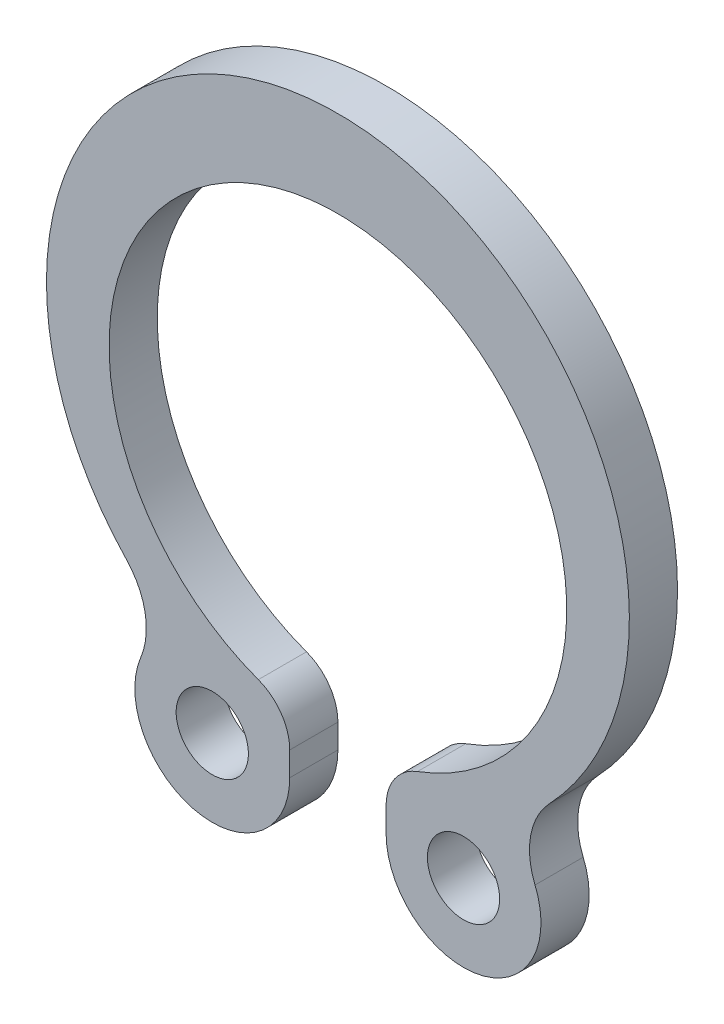
ISO-10303-21;
HEADER;
FILE_DESCRIPTION(('STEP AP214'),'2;1');
FILE_NAME('part.step','',(''),(''),'','','');
FILE_SCHEMA(('AUTOMOTIVE_DESIGN { 1 0 10303 214 1 1 1 1 }'));
ENDSEC;
DATA;
#1=APPLICATION_CONTEXT('core data for automotive mechanical design processes');
#2=APPLICATION_PROTOCOL_DEFINITION('international standard','automotive_design',2000,#1);
#3=PRODUCT_CONTEXT('',#1,'mechanical');
#4=PRODUCT('Part','Part','',(#3));
#5=PRODUCT_RELATED_PRODUCT_CATEGORY('part','',(#4));
#6=PRODUCT_DEFINITION_FORMATION('','',#4);
#7=PRODUCT_DEFINITION_CONTEXT('part definition',#1,'design');
#8=PRODUCT_DEFINITION('design','',#6,#7);
#9=PRODUCT_DEFINITION_SHAPE('','',#8);
#10=(LENGTH_UNIT() NAMED_UNIT(*) SI_UNIT(.MILLI.,.METRE.));
#11=(NAMED_UNIT(*) PLANE_ANGLE_UNIT() SI_UNIT($,.RADIAN.));
#12=(NAMED_UNIT(*) SI_UNIT($,.STERADIAN.) SOLID_ANGLE_UNIT());
#13=UNCERTAINTY_MEASURE_WITH_UNIT(LENGTH_MEASURE(1.E-05),#10,'distance_accuracy_value','');
#14=(GEOMETRIC_REPRESENTATION_CONTEXT(3) GLOBAL_UNCERTAINTY_ASSIGNED_CONTEXT((#13)) GLOBAL_UNIT_ASSIGNED_CONTEXT((#10,
#11,#12)) REPRESENTATION_CONTEXT('',''));
#15=CARTESIAN_POINT('',(0.,0.,0.));
#16=DIRECTION('',(0.,0.,1.));
#17=DIRECTION('',(1.,0.,0.));
#18=AXIS2_PLACEMENT_3D('',#15,#16,#17);
#19=CARTESIAN_POINT('',(-2.,-5.39096466321196,1.));
#20=DIRECTION('',(0.,0.,1.));
#21=DIRECTION('',(1.,0.,0.));
#22=AXIS2_PLACEMENT_3D('',#19,#20,#21);
#23=PLANE('',#22);
#24=CARTESIAN_POINT('',(-2.60768151031978,-5.89096466321196,1.));
#25=DIRECTION('',(0.,0.,1.));
#26=DIRECTION('',(1.,0.,0.));
#27=AXIS2_PLACEMENT_3D('',#24,#25,#26);
#28=CIRCLE('',#27,0.75);
#29=CARTESIAN_POINT('',(-1.85768151031978,-5.89096466321196,1.));
#30=VERTEX_POINT('',#29);
#31=EDGE_CURVE('E163',#30,#30,#28,.T.);
#32=ORIENTED_EDGE('',*,*,#31,.F.);
#33=EDGE_LOOP('',(#32));
#34=FACE_BOUND('',#33,.T.);
#35=CARTESIAN_POINT('',(-2.,-5.39096466321196,1.));
#36=DIRECTION('',(0.,0.,1.));
#37=DIRECTION('',(1.,0.,0.));
#38=AXIS2_PLACEMENT_3D('',#35,#36,#37);
#39=CIRCLE('',#38,0.999999999999999);
#40=CARTESIAN_POINT('',(-0.999999999999999,-5.39096466321196,1.));
#41=VERTEX_POINT('',#40);
#42=CARTESIAN_POINT('',(-1.65217391304348,-4.45340559134901,1.));
#43=VERTEX_POINT('',#42);
#44=EDGE_CURVE('E187',#41,#43,#39,.T.);
#45=ORIENTED_EDGE('',*,*,#44,.T.);
#46=CARTESIAN_POINT('',(0.,0.,1.));
#47=DIRECTION('',(0.,0.,-1.));
#48=DIRECTION('',(1.,0.,0.));
#49=AXIS2_PLACEMENT_3D('',#46,#47,#48);
#50=CIRCLE('',#49,4.75);
#51=CARTESIAN_POINT('',(1.65217391304348,-4.45340559134901,1.));
#52=VERTEX_POINT('',#51);
#53=EDGE_CURVE('E110',#43,#52,#50,.T.);
#54=ORIENTED_EDGE('',*,*,#53,.T.);
#55=CARTESIAN_POINT('',(2.,-5.39096466321196,1.));
#56=DIRECTION('',(0.,0.,1.));
#57=DIRECTION('',(-1.,0.,0.));
#58=AXIS2_PLACEMENT_3D('',#55,#56,#57);
#59=CIRCLE('',#58,0.999999999999999);
#60=CARTESIAN_POINT('',(1.,-5.39096466321196,1.));
#61=VERTEX_POINT('',#60);
#62=EDGE_CURVE('E217',#52,#61,#59,.T.);
#63=ORIENTED_EDGE('',*,*,#62,.T.);
#64=DIRECTION('',(0.,-1.,0.));
#65=VECTOR('',#64,1.);
#66=CARTESIAN_POINT('',(1.,-5.39096466321196,1.));
#67=LINE('',#66,#65);
#68=CARTESIAN_POINT('',(1.,-5.89096466321196,1.));
#69=VERTEX_POINT('',#68);
#70=EDGE_CURVE('E237',#61,#69,#67,.T.);
#71=ORIENTED_EDGE('',*,*,#70,.T.);
#72=CARTESIAN_POINT('',(2.60768151031978,-5.89096466321196,1.));
#73=DIRECTION('',(0.,0.,1.));
#74=DIRECTION('',(1.,0.,0.));
#75=AXIS2_PLACEMENT_3D('',#72,#73,#74);
#76=CIRCLE('',#75,1.60768151031978);
#77=CARTESIAN_POINT('',(4.0919429641642,-5.27322056145481,1.));
#78=VERTEX_POINT('',#77);
#79=EDGE_CURVE('E233',#69,#78,#76,.T.);
#80=ORIENTED_EDGE('',*,*,#79,.T.);
#81=CARTESIAN_POINT('',(5.47678950651436,-4.696852576448,1.));
#82=DIRECTION('',(0.,0.,-1.));
#83=DIRECTION('',(-1.,0.,0.));
#84=AXIS2_PLACEMENT_3D('',#81,#82,#83);
#85=CIRCLE('',#84,1.5);
#86=CARTESIAN_POINT('',(4.38868563104793,-3.66436530960402,1.));
#87=VERTEX_POINT('',#86);
#88=EDGE_CURVE('E236',#78,#87,#85,.T.);
#89=ORIENTED_EDGE('',*,*,#88,.T.);
#90=CARTESIAN_POINT('',(0.,0.5,1.));
#91=DIRECTION('',(0.,0.,1.));
#92=DIRECTION('',(1.,0.,0.));
#93=AXIS2_PLACEMENT_3D('',#90,#91,#92);
#94=CIRCLE('',#93,6.05);
#95=CARTESIAN_POINT('',(-4.38868563104793,-3.66436530960403,1.));
#96=VERTEX_POINT('',#95);
#97=EDGE_CURVE('E135',#87,#96,#94,.T.);
#98=ORIENTED_EDGE('',*,*,#97,.T.);
#99=CARTESIAN_POINT('',(-5.47678950651436,-4.696852576448,1.));
#100=DIRECTION('',(0.,0.,-1.));
#101=DIRECTION('',(1.,0.,0.));
#102=AXIS2_PLACEMENT_3D('',#99,#100,#101);
#103=CIRCLE('',#102,1.5);
#104=CARTESIAN_POINT('',(-4.0919429641642,-5.27322056145481,1.));
#105=VERTEX_POINT('',#104);
#106=EDGE_CURVE('E129',#96,#105,#103,.T.);
#107=ORIENTED_EDGE('',*,*,#106,.T.);
#108=CARTESIAN_POINT('',(-2.60768151031978,-5.89096466321196,1.));
#109=DIRECTION('',(0.,0.,1.));
#110=DIRECTION('',(-1.,0.,0.));
#111=AXIS2_PLACEMENT_3D('',#108,#109,#110);
#112=CIRCLE('',#111,1.60768151031978);
#113=CARTESIAN_POINT('',(-0.999999999999999,-5.89096466321196,1.));
#114=VERTEX_POINT('',#113);
#115=EDGE_CURVE('E133',#105,#114,#112,.T.);
#116=ORIENTED_EDGE('',*,*,#115,.T.);
#117=DIRECTION('',(0.,1.,0.));
#118=VECTOR('',#117,1.);
#119=CARTESIAN_POINT('',(-0.999999999999999,-5.39096466321196,1.));
#120=LINE('',#119,#118);
#121=EDGE_CURVE('E61',#114,#41,#120,.T.);
#122=ORIENTED_EDGE('',*,*,#121,.T.);
#123=EDGE_LOOP('',(#45,#54,#63,#71,#80,#89,#98,#107,#116,#122));
#124=FACE_BOUND('',#123,.T.);
#125=CARTESIAN_POINT('',(2.60768151031978,-5.89096466321196,1.));
#126=DIRECTION('',(0.,0.,1.));
#127=DIRECTION('',(-1.,0.,0.));
#128=AXIS2_PLACEMENT_3D('',#125,#126,#127);
#129=CIRCLE('',#128,0.75);
#130=CARTESIAN_POINT('',(1.85768151031978,-5.89096466321196,1.));
#131=VERTEX_POINT('',#130);
#132=EDGE_CURVE('E259',#131,#131,#129,.T.);
#133=ORIENTED_EDGE('',*,*,#132,.F.);
#134=EDGE_LOOP('',(#133));
#135=FACE_BOUND('',#134,.T.);
#136=ADVANCED_FACE('F43',(#34,#124,#135),#23,.T.);
#137=CARTESIAN_POINT('',(-2.,-5.39096466321196,0.));
#138=DIRECTION('',(0.,0.,1.));
#139=DIRECTION('',(1.,0.,0.));
#140=AXIS2_PLACEMENT_3D('',#137,#138,#139);
#141=PLANE('',#140);
#142=CARTESIAN_POINT('',(-2.,-5.39096466321196,0.));
#143=DIRECTION('',(0.,0.,1.));
#144=DIRECTION('',(1.,0.,0.));
#145=AXIS2_PLACEMENT_3D('',#142,#143,#144);
#146=CIRCLE('',#145,0.999999999999999);
#147=CARTESIAN_POINT('',(-0.999999999999999,-5.39096466321196,0.));
#148=VERTEX_POINT('',#147);
#149=CARTESIAN_POINT('',(-1.65217391304348,-4.45340559134901,0.));
#150=VERTEX_POINT('',#149);
#151=EDGE_CURVE('E158',#148,#150,#146,.T.);
#152=ORIENTED_EDGE('',*,*,#151,.F.);
#153=DIRECTION('',(0.,1.,0.));
#154=VECTOR('',#153,1.);
#155=CARTESIAN_POINT('',(-0.999999999999999,-5.39096466321196,0.));
#156=LINE('',#155,#154);
#157=CARTESIAN_POINT('',(-0.999999999999999,-5.89096466321196,0.));
#158=VERTEX_POINT('',#157);
#159=EDGE_CURVE('E102',#158,#148,#156,.T.);
#160=ORIENTED_EDGE('',*,*,#159,.F.);
#161=CARTESIAN_POINT('',(-2.60768151031978,-5.89096466321196,0.));
#162=DIRECTION('',(0.,0.,1.));
#163=DIRECTION('',(-1.,0.,0.));
#164=AXIS2_PLACEMENT_3D('',#161,#162,#163);
#165=CIRCLE('',#164,1.60768151031978);
#166=CARTESIAN_POINT('',(-4.0919429641642,-5.27322056145481,0.));
#167=VERTEX_POINT('',#166);
#168=EDGE_CURVE('E96',#167,#158,#165,.T.);
#169=ORIENTED_EDGE('',*,*,#168,.F.);
#170=CARTESIAN_POINT('',(-5.47678950651436,-4.696852576448,0.));
#171=DIRECTION('',(0.,0.,-1.));
#172=DIRECTION('',(1.,0.,0.));
#173=AXIS2_PLACEMENT_3D('',#170,#171,#172);
#174=CIRCLE('',#173,1.5);
#175=CARTESIAN_POINT('',(-4.38868563104793,-3.66436530960403,0.));
#176=VERTEX_POINT('',#175);
#177=EDGE_CURVE('E144',#176,#167,#174,.T.);
#178=ORIENTED_EDGE('',*,*,#177,.F.);
#179=CARTESIAN_POINT('',(0.,0.5,0.));
#180=DIRECTION('',(0.,0.,1.));
#181=DIRECTION('',(1.,0.,0.));
#182=AXIS2_PLACEMENT_3D('',#179,#180,#181);
#183=CIRCLE('',#182,6.05);
#184=CARTESIAN_POINT('',(4.38868563104793,-3.66436530960402,0.));
#185=VERTEX_POINT('',#184);
#186=EDGE_CURVE('E178',#185,#176,#183,.T.);
#187=ORIENTED_EDGE('',*,*,#186,.F.);
#188=CARTESIAN_POINT('',(5.47678950651436,-4.696852576448,0.));
#189=DIRECTION('',(0.,0.,-1.));
#190=DIRECTION('',(-1.,0.,0.));
#191=AXIS2_PLACEMENT_3D('',#188,#189,#190);
#192=CIRCLE('',#191,1.5);
#193=CARTESIAN_POINT('',(4.0919429641642,-5.27322056145481,0.));
#194=VERTEX_POINT('',#193);
#195=EDGE_CURVE('E175',#194,#185,#192,.T.);
#196=ORIENTED_EDGE('',*,*,#195,.F.);
#197=CARTESIAN_POINT('',(2.60768151031978,-5.89096466321196,0.));
#198=DIRECTION('',(0.,0.,1.));
#199=DIRECTION('',(1.,0.,0.));
#200=AXIS2_PLACEMENT_3D('',#197,#198,#199);
#201=CIRCLE('',#200,1.60768151031978);
#202=CARTESIAN_POINT('',(1.,-5.89096466321196,0.));
#203=VERTEX_POINT('',#202);
#204=EDGE_CURVE('E172',#203,#194,#201,.T.);
#205=ORIENTED_EDGE('',*,*,#204,.F.);
#206=DIRECTION('',(0.,-1.,0.));
#207=VECTOR('',#206,1.);
#208=CARTESIAN_POINT('',(1.,-5.39096466321196,0.));
#209=LINE('',#208,#207);
#210=CARTESIAN_POINT('',(1.,-5.39096466321196,0.));
#211=VERTEX_POINT('',#210);
#212=EDGE_CURVE('E169',#211,#203,#209,.T.);
#213=ORIENTED_EDGE('',*,*,#212,.F.);
#214=CARTESIAN_POINT('',(2.,-5.39096466321196,0.));
#215=DIRECTION('',(0.,0.,1.));
#216=DIRECTION('',(-1.,0.,0.));
#217=AXIS2_PLACEMENT_3D('',#214,#215,#216);
#218=CIRCLE('',#217,0.999999999999999);
#219=CARTESIAN_POINT('',(1.65217391304348,-4.45340559134901,0.));
#220=VERTEX_POINT('',#219);
#221=EDGE_CURVE('E166',#220,#211,#218,.T.);
#222=ORIENTED_EDGE('',*,*,#221,.F.);
#223=CARTESIAN_POINT('',(0.,0.,0.));
#224=DIRECTION('',(0.,0.,-1.));
#225=DIRECTION('',(1.,0.,0.));
#226=AXIS2_PLACEMENT_3D('',#223,#224,#225);
#227=CIRCLE('',#226,4.75);
#228=EDGE_CURVE('E162',#150,#220,#227,.T.);
#229=ORIENTED_EDGE('',*,*,#228,.F.);
#230=EDGE_LOOP('',(#152,#160,#169,#178,#187,#196,#205,#213,#222,#229));
#231=FACE_BOUND('',#230,.T.);
#232=CARTESIAN_POINT('',(-2.60768151031978,-5.89096466321196,0.));
#233=DIRECTION('',(0.,0.,1.));
#234=DIRECTION('',(1.,0.,0.));
#235=AXIS2_PLACEMENT_3D('',#232,#233,#234);
#236=CIRCLE('',#235,0.75);
#237=CARTESIAN_POINT('',(-1.85768151031978,-5.89096466321196,0.));
#238=VERTEX_POINT('',#237);
#239=EDGE_CURVE('E255',#238,#238,#236,.T.);
#240=ORIENTED_EDGE('',*,*,#239,.T.);
#241=EDGE_LOOP('',(#240));
#242=FACE_BOUND('',#241,.T.);
#243=CARTESIAN_POINT('',(2.60768151031978,-5.89096466321196,0.));
#244=DIRECTION('',(0.,0.,1.));
#245=DIRECTION('',(-1.,0.,0.));
#246=AXIS2_PLACEMENT_3D('',#243,#244,#245);
#247=CIRCLE('',#246,0.75);
#248=CARTESIAN_POINT('',(1.85768151031978,-5.89096466321196,0.));
#249=VERTEX_POINT('',#248);
#250=EDGE_CURVE('E263',#249,#249,#247,.T.);
#251=ORIENTED_EDGE('',*,*,#250,.T.);
#252=EDGE_LOOP('',(#251));
#253=FACE_BOUND('',#252,.T.);
#254=ADVANCED_FACE('F221',(#231,#242,#253),#141,.F.);
#255=CARTESIAN_POINT('',(-2.,-5.39096466321196,1.));
#256=DIRECTION('',(0.,0.,-1.));
#257=DIRECTION('',(-1.,0.,0.));
#258=AXIS2_PLACEMENT_3D('',#255,#256,#257);
#259=CYLINDRICAL_SURFACE('',#258,0.999999999999999);
#260=ORIENTED_EDGE('',*,*,#151,.T.);
#261=DIRECTION('',(0.,0.,-1.));
#262=VECTOR('',#261,1.);
#263=CARTESIAN_POINT('',(-1.65217391304348,-4.45340559134901,1.));
#264=LINE('',#263,#262);
#265=EDGE_CURVE('E11',#43,#150,#264,.T.);
#266=ORIENTED_EDGE('',*,*,#265,.F.);
#267=ORIENTED_EDGE('',*,*,#44,.F.);
#268=DIRECTION('',(0.,0.,-1.));
#269=VECTOR('',#268,1.);
#270=CARTESIAN_POINT('',(-0.999999999999999,-5.39096466321196,1.));
#271=LINE('',#270,#269);
#272=EDGE_CURVE('E154',#41,#148,#271,.T.);
#273=ORIENTED_EDGE('',*,*,#272,.T.);
#274=EDGE_LOOP('',(#260,#266,#267,#273));
#275=FACE_BOUND('',#274,.T.);
#276=ADVANCED_FACE('F45',(#275),#259,.T.);
#277=CARTESIAN_POINT('',(0.,0.,1.));
#278=DIRECTION('',(0.,0.,-1.));
#279=DIRECTION('',(-1.,0.,0.));
#280=AXIS2_PLACEMENT_3D('',#277,#278,#279);
#281=CYLINDRICAL_SURFACE('',#280,4.75);
#282=ORIENTED_EDGE('',*,*,#228,.T.);
#283=DIRECTION('',(0.,0.,-1.));
#284=VECTOR('',#283,1.);
#285=CARTESIAN_POINT('',(1.65217391304348,-4.45340559134901,1.));
#286=LINE('',#285,#284);
#287=EDGE_CURVE('E53',#52,#220,#286,.T.);
#288=ORIENTED_EDGE('',*,*,#287,.F.);
#289=ORIENTED_EDGE('',*,*,#53,.F.);
#290=ORIENTED_EDGE('',*,*,#265,.T.);
#291=EDGE_LOOP('',(#282,#288,#289,#290));
#292=FACE_BOUND('',#291,.T.);
#293=ADVANCED_FACE('F306',(#292),#281,.F.);
#294=CARTESIAN_POINT('',(2.,-5.39096466321196,1.));
#295=DIRECTION('',(0.,0.,-1.));
#296=DIRECTION('',(-1.,0.,0.));
#297=AXIS2_PLACEMENT_3D('',#294,#295,#296);
#298=CYLINDRICAL_SURFACE('',#297,0.999999999999999);
#299=ORIENTED_EDGE('',*,*,#221,.T.);
#300=DIRECTION('',(0.,0.,-1.));
#301=VECTOR('',#300,1.);
#302=CARTESIAN_POINT('',(1.,-5.39096466321196,1.));
#303=LINE('',#302,#301);
#304=EDGE_CURVE('E206',#61,#211,#303,.T.);
#305=ORIENTED_EDGE('',*,*,#304,.F.);
#306=ORIENTED_EDGE('',*,*,#62,.F.);
#307=ORIENTED_EDGE('',*,*,#287,.T.);
#308=EDGE_LOOP('',(#299,#305,#306,#307));
#309=FACE_BOUND('',#308,.T.);
#310=ADVANCED_FACE('F215',(#309),#298,.T.);
#311=CARTESIAN_POINT('',(1.,-5.39096466321196,1.));
#312=DIRECTION('',(1.,0.,0.));
#313=DIRECTION('',(0.,0.,-1.));
#314=AXIS2_PLACEMENT_3D('',#311,#312,#313);
#315=PLANE('',#314);
#316=ORIENTED_EDGE('',*,*,#212,.T.);
#317=DIRECTION('',(0.,0.,-1.));
#318=VECTOR('',#317,1.);
#319=CARTESIAN_POINT('',(1.,-5.89096466321196,1.));
#320=LINE('',#319,#318);
#321=EDGE_CURVE('E202',#69,#203,#320,.T.);
#322=ORIENTED_EDGE('',*,*,#321,.F.);
#323=ORIENTED_EDGE('',*,*,#70,.F.);
#324=ORIENTED_EDGE('',*,*,#304,.T.);
#325=EDGE_LOOP('',(#316,#322,#323,#324));
#326=FACE_BOUND('',#325,.T.);
#327=ADVANCED_FACE('F227',(#326),#315,.F.);
#328=CARTESIAN_POINT('',(2.60768151031978,-5.89096466321196,1.));
#329=DIRECTION('',(0.,0.,-1.));
#330=DIRECTION('',(-1.,0.,0.));
#331=AXIS2_PLACEMENT_3D('',#328,#329,#330);
#332=CYLINDRICAL_SURFACE('',#331,1.60768151031978);
#333=ORIENTED_EDGE('',*,*,#204,.T.);
#334=DIRECTION('',(0.,0.,-1.));
#335=VECTOR('',#334,1.);
#336=CARTESIAN_POINT('',(4.0919429641642,-5.27322056145481,1.));
#337=LINE('',#336,#335);
#338=EDGE_CURVE('E198',#78,#194,#337,.T.);
#339=ORIENTED_EDGE('',*,*,#338,.F.);
#340=ORIENTED_EDGE('',*,*,#79,.F.);
#341=ORIENTED_EDGE('',*,*,#321,.T.);
#342=EDGE_LOOP('',(#333,#339,#340,#341));
#343=FACE_BOUND('',#342,.T.);
#344=ADVANCED_FACE('F231',(#343),#332,.T.);
#345=CARTESIAN_POINT('',(5.47678950651436,-4.696852576448,1.));
#346=DIRECTION('',(0.,0.,-1.));
#347=DIRECTION('',(-1.,0.,0.));
#348=AXIS2_PLACEMENT_3D('',#345,#346,#347);
#349=CYLINDRICAL_SURFACE('',#348,1.5);
#350=ORIENTED_EDGE('',*,*,#195,.T.);
#351=DIRECTION('',(0.,0.,-1.));
#352=VECTOR('',#351,1.);
#353=CARTESIAN_POINT('',(4.38868563104793,-3.66436530960402,1.));
#354=LINE('',#353,#352);
#355=EDGE_CURVE('E194',#87,#185,#354,.T.);
#356=ORIENTED_EDGE('',*,*,#355,.F.);
#357=ORIENTED_EDGE('',*,*,#88,.F.);
#358=ORIENTED_EDGE('',*,*,#338,.T.);
#359=EDGE_LOOP('',(#350,#356,#357,#358));
#360=FACE_BOUND('',#359,.T.);
#361=ADVANCED_FACE('F296',(#360),#349,.F.);
#362=CARTESIAN_POINT('',(0.,0.5,1.));
#363=DIRECTION('',(0.,0.,-1.));
#364=DIRECTION('',(-1.,0.,0.));
#365=AXIS2_PLACEMENT_3D('',#362,#363,#364);
#366=CYLINDRICAL_SURFACE('',#365,6.05);
#367=ORIENTED_EDGE('',*,*,#186,.T.);
#368=DIRECTION('',(0.,0.,-1.));
#369=VECTOR('',#368,1.);
#370=CARTESIAN_POINT('',(-4.38868563104793,-3.66436530960403,1.));
#371=LINE('',#370,#369);
#372=EDGE_CURVE('E146',#96,#176,#371,.T.);
#373=ORIENTED_EDGE('',*,*,#372,.F.);
#374=ORIENTED_EDGE('',*,*,#97,.F.);
#375=ORIENTED_EDGE('',*,*,#355,.T.);
#376=EDGE_LOOP('',(#367,#373,#374,#375));
#377=FACE_BOUND('',#376,.T.);
#378=ADVANCED_FACE('F293',(#377),#366,.T.);
#379=CARTESIAN_POINT('',(-5.47678950651436,-4.696852576448,1.));
#380=DIRECTION('',(0.,0.,-1.));
#381=DIRECTION('',(-1.,0.,0.));
#382=AXIS2_PLACEMENT_3D('',#379,#380,#381);
#383=CYLINDRICAL_SURFACE('',#382,1.5);
#384=ORIENTED_EDGE('',*,*,#177,.T.);
#385=DIRECTION('',(0.,0.,-1.));
#386=VECTOR('',#385,1.);
#387=CARTESIAN_POINT('',(-4.0919429641642,-5.27322056145481,1.));
#388=LINE('',#387,#386);
#389=EDGE_CURVE('E141',#105,#167,#388,.T.);
#390=ORIENTED_EDGE('',*,*,#389,.F.);
#391=ORIENTED_EDGE('',*,*,#106,.F.);
#392=ORIENTED_EDGE('',*,*,#372,.T.);
#393=EDGE_LOOP('',(#384,#390,#391,#392));
#394=FACE_BOUND('',#393,.T.);
#395=ADVANCED_FACE('F142',(#394),#383,.F.);
#396=CARTESIAN_POINT('',(-2.60768151031978,-5.89096466321196,1.));
#397=DIRECTION('',(0.,0.,-1.));
#398=DIRECTION('',(-1.,0.,0.));
#399=AXIS2_PLACEMENT_3D('',#396,#397,#398);
#400=CYLINDRICAL_SURFACE('',#399,1.60768151031978);
#401=ORIENTED_EDGE('',*,*,#168,.T.);
#402=DIRECTION('',(0.,0.,-1.));
#403=VECTOR('',#402,1.);
#404=CARTESIAN_POINT('',(-0.999999999999999,-5.89096466321196,1.));
#405=LINE('',#404,#403);
#406=EDGE_CURVE('E147',#114,#158,#405,.T.);
#407=ORIENTED_EDGE('',*,*,#406,.F.);
#408=ORIENTED_EDGE('',*,*,#115,.F.);
#409=ORIENTED_EDGE('',*,*,#389,.T.);
#410=EDGE_LOOP('',(#401,#407,#408,#409));
#411=FACE_BOUND('',#410,.T.);
#412=ADVANCED_FACE('F149',(#411),#400,.T.);
#413=CARTESIAN_POINT('',(-0.999999999999999,-5.39096466321196,1.));
#414=DIRECTION('',(-1.,0.,0.));
#415=DIRECTION('',(0.,0.,1.));
#416=AXIS2_PLACEMENT_3D('',#413,#414,#415);
#417=PLANE('',#416);
#418=ORIENTED_EDGE('',*,*,#159,.T.);
#419=ORIENTED_EDGE('',*,*,#272,.F.);
#420=ORIENTED_EDGE('',*,*,#121,.F.);
#421=ORIENTED_EDGE('',*,*,#406,.T.);
#422=EDGE_LOOP('',(#418,#419,#420,#421));
#423=FACE_BOUND('',#422,.T.);
#424=ADVANCED_FACE('F286',(#423),#417,.F.);
#425=CARTESIAN_POINT('',(-2.60768151031978,-5.89096466321196,1.));
#426=DIRECTION('',(0.,0.,-1.));
#427=DIRECTION('',(-1.,0.,0.));
#428=AXIS2_PLACEMENT_3D('',#425,#426,#427);
#429=CYLINDRICAL_SURFACE('',#428,0.75);
#430=ORIENTED_EDGE('',*,*,#31,.T.);
#431=EDGE_LOOP('',(#430));
#432=FACE_BOUND('',#431,.T.);
#433=ORIENTED_EDGE('',*,*,#239,.F.);
#434=EDGE_LOOP('',(#433));
#435=FACE_BOUND('',#434,.T.);
#436=ADVANCED_FACE('F283',(#432,#435),#429,.F.);
#437=CARTESIAN_POINT('',(2.60768151031978,-5.89096466321196,1.));
#438=DIRECTION('',(0.,0.,-1.));
#439=DIRECTION('',(-1.,0.,0.));
#440=AXIS2_PLACEMENT_3D('',#437,#438,#439);
#441=CYLINDRICAL_SURFACE('',#440,0.75);
#442=ORIENTED_EDGE('',*,*,#132,.T.);
#443=EDGE_LOOP('',(#442));
#444=FACE_BOUND('',#443,.T.);
#445=ORIENTED_EDGE('',*,*,#250,.F.);
#446=EDGE_LOOP('',(#445));
#447=FACE_BOUND('',#446,.T.);
#448=ADVANCED_FACE('F272',(#444,#447),#441,.F.);
#449=CLOSED_SHELL('',(#136,#254,#276,#293,#310,#327,#344,#361,#378,#395,#412,#424,#436,#448));
#450=MANIFOLD_SOLID_BREP('B2',#449);
#451=ADVANCED_BREP_SHAPE_REPRESENTATION('',(#18,#450),#14);
#452=SHAPE_DEFINITION_REPRESENTATION(#9,#451);
ENDSEC;
END-ISO-10303-21;
